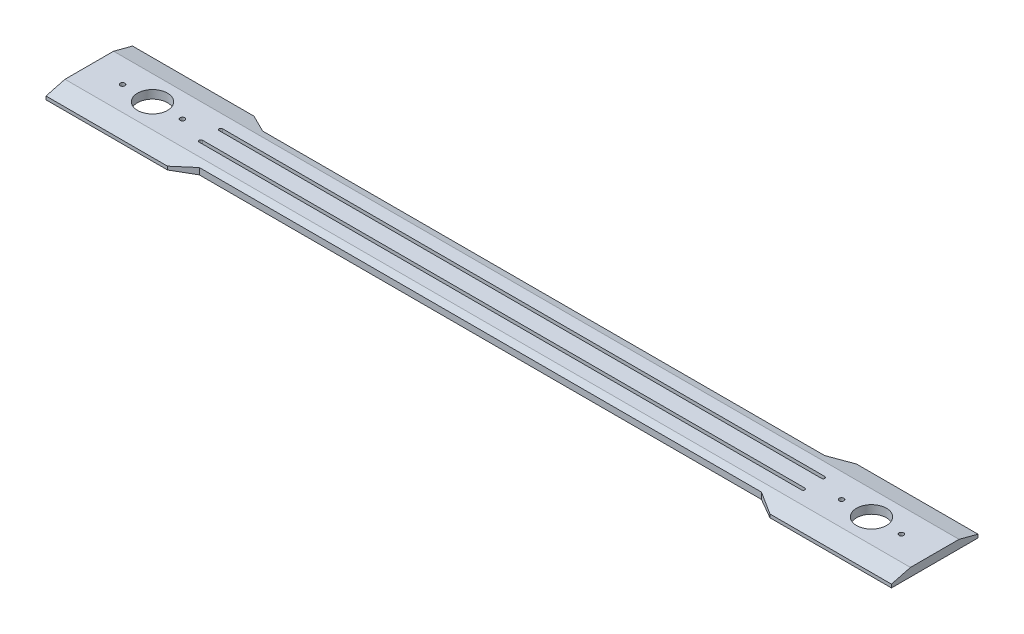
ISO-10303-21;
HEADER;
FILE_DESCRIPTION(('STEP AP214'),'2;1');
FILE_NAME('part.step','',(''),(''),'','','');
FILE_SCHEMA(('AUTOMOTIVE_DESIGN { 1 0 10303 214 1 1 1 1 }'));
ENDSEC;
DATA;
#1=APPLICATION_CONTEXT('core data for automotive mechanical design processes');
#2=APPLICATION_PROTOCOL_DEFINITION('international standard','automotive_design',2000,#1);
#3=PRODUCT_CONTEXT('',#1,'mechanical');
#4=PRODUCT('Part','Part','',(#3));
#5=PRODUCT_RELATED_PRODUCT_CATEGORY('part','',(#4));
#6=PRODUCT_DEFINITION_FORMATION('','',#4);
#7=PRODUCT_DEFINITION_CONTEXT('part definition',#1,'design');
#8=PRODUCT_DEFINITION('design','',#6,#7);
#9=PRODUCT_DEFINITION_SHAPE('','',#8);
#10=(LENGTH_UNIT() NAMED_UNIT(*) SI_UNIT(.MILLI.,.METRE.));
#11=(NAMED_UNIT(*) PLANE_ANGLE_UNIT() SI_UNIT($,.RADIAN.));
#12=(NAMED_UNIT(*) SI_UNIT($,.STERADIAN.) SOLID_ANGLE_UNIT());
#13=UNCERTAINTY_MEASURE_WITH_UNIT(LENGTH_MEASURE(1.E-05),#10,'distance_accuracy_value','');
#14=(GEOMETRIC_REPRESENTATION_CONTEXT(3) GLOBAL_UNCERTAINTY_ASSIGNED_CONTEXT((#13)) GLOBAL_UNIT_ASSIGNED_CONTEXT((#10,
#11,#12)) REPRESENTATION_CONTEXT('',''));
#15=CARTESIAN_POINT('',(0.,0.,0.));
#16=DIRECTION('',(0.,0.,1.));
#17=DIRECTION('',(1.,0.,0.));
#18=AXIS2_PLACEMENT_3D('',#15,#16,#17);
#19=CARTESIAN_POINT('',(0.,25.,0.));
#20=DIRECTION('',(0.,-1.,0.));
#21=DIRECTION('',(0.,0.,-1.));
#22=AXIS2_PLACEMENT_3D('',#19,#20,#21);
#23=PLANE('',#22);
#24=DIRECTION('',(0.,0.,1.));
#25=VECTOR('',#24,1.);
#26=CARTESIAN_POINT('',(-1270.,25.,-130.));
#27=LINE('',#26,#25);
#28=CARTESIAN_POINT('',(-1270.,25.,-73.));
#29=VERTEX_POINT('',#28);
#30=CARTESIAN_POINT('',(-1270.,25.,73.));
#31=VERTEX_POINT('',#30);
#32=EDGE_CURVE('E203',#29,#31,#27,.T.);
#33=ORIENTED_EDGE('',*,*,#32,.T.);
#34=DIRECTION('',(1.,0.,0.));
#35=VECTOR('',#34,1.);
#36=CARTESIAN_POINT('',(-1270.,25.,73.));
#37=LINE('',#36,#35);
#38=CARTESIAN_POINT('',(1270.,25.,73.));
#39=VERTEX_POINT('',#38);
#40=EDGE_CURVE('E58',#31,#39,#37,.T.);
#41=ORIENTED_EDGE('',*,*,#40,.T.);
#42=DIRECTION('',(0.,0.,-1.));
#43=VECTOR('',#42,1.);
#44=CARTESIAN_POINT('',(1270.,25.,-130.));
#45=LINE('',#44,#43);
#46=CARTESIAN_POINT('',(1270.,25.,-73.));
#47=VERTEX_POINT('',#46);
#48=EDGE_CURVE('E207',#39,#47,#45,.T.);
#49=ORIENTED_EDGE('',*,*,#48,.T.);
#50=DIRECTION('',(1.,0.,0.));
#51=VECTOR('',#50,1.);
#52=CARTESIAN_POINT('',(-1270.,25.,-73.));
#53=LINE('',#52,#51);
#54=EDGE_CURVE('E397',#29,#47,#53,.T.);
#55=ORIENTED_EDGE('',*,*,#54,.F.);
#56=EDGE_LOOP('',(#33,#41,#49,#55));
#57=FACE_BOUND('',#56,.T.);
#58=CARTESIAN_POINT('',(-1080.,25.,0.));
#59=DIRECTION('',(0.,1.,0.));
#60=DIRECTION('',(0.,0.,1.));
#61=AXIS2_PLACEMENT_3D('',#58,#59,#60);
#62=CIRCLE('',#61,45.);
#63=CARTESIAN_POINT('',(-1080.,25.,45.));
#64=VERTEX_POINT('',#63);
#65=EDGE_CURVE('E281',#64,#64,#62,.T.);
#66=ORIENTED_EDGE('',*,*,#65,.F.);
#67=EDGE_LOOP('',(#66));
#68=FACE_BOUND('',#67,.T.);
#69=CARTESIAN_POINT('',(-1170.,25.,0.));
#70=DIRECTION('',(0.,1.,0.));
#71=DIRECTION('',(0.,0.,1.));
#72=AXIS2_PLACEMENT_3D('',#69,#70,#71);
#73=CIRCLE('',#72,6.99999999999992);
#74=CARTESIAN_POINT('',(-1170.,25.,6.99999999999992));
#75=VERTEX_POINT('',#74);
#76=EDGE_CURVE('E297',#75,#75,#73,.T.);
#77=ORIENTED_EDGE('',*,*,#76,.F.);
#78=EDGE_LOOP('',(#77));
#79=FACE_BOUND('',#78,.T.);
#80=CARTESIAN_POINT('',(-990.,25.,0.));
#81=DIRECTION('',(0.,1.,0.));
#82=DIRECTION('',(0.,0.,1.));
#83=AXIS2_PLACEMENT_3D('',#80,#81,#82);
#84=CIRCLE('',#83,7.00000000000004);
#85=CARTESIAN_POINT('',(-990.,25.,7.00000000000004));
#86=VERTEX_POINT('',#85);
#87=EDGE_CURVE('E290',#86,#86,#84,.T.);
#88=ORIENTED_EDGE('',*,*,#87,.F.);
#89=EDGE_LOOP('',(#88));
#90=FACE_BOUND('',#89,.T.);
#91=CARTESIAN_POINT('',(1080.,25.,0.));
#92=DIRECTION('',(0.,-1.,0.));
#93=DIRECTION('',(0.,0.,1.));
#94=AXIS2_PLACEMENT_3D('',#91,#92,#93);
#95=CIRCLE('',#94,45.);
#96=CARTESIAN_POINT('',(1080.,25.,45.));
#97=VERTEX_POINT('',#96);
#98=EDGE_CURVE('E302',#97,#97,#95,.T.);
#99=ORIENTED_EDGE('',*,*,#98,.T.);
#100=EDGE_LOOP('',(#99));
#101=FACE_BOUND('',#100,.T.);
#102=CARTESIAN_POINT('',(1170.,25.,0.));
#103=DIRECTION('',(0.,-1.,0.));
#104=DIRECTION('',(0.,0.,1.));
#105=AXIS2_PLACEMENT_3D('',#102,#103,#104);
#106=CIRCLE('',#105,6.99999999999992);
#107=CARTESIAN_POINT('',(1170.,25.,6.99999999999992));
#108=VERTEX_POINT('',#107);
#109=EDGE_CURVE('E315',#108,#108,#106,.T.);
#110=ORIENTED_EDGE('',*,*,#109,.T.);
#111=EDGE_LOOP('',(#110));
#112=FACE_BOUND('',#111,.T.);
#113=CARTESIAN_POINT('',(990.,25.,0.));
#114=DIRECTION('',(0.,-1.,0.));
#115=DIRECTION('',(0.,0.,1.));
#116=AXIS2_PLACEMENT_3D('',#113,#114,#115);
#117=CIRCLE('',#116,7.00000000000004);
#118=CARTESIAN_POINT('',(990.,25.,7.00000000000004));
#119=VERTEX_POINT('',#118);
#120=EDGE_CURVE('E308',#119,#119,#117,.T.);
#121=ORIENTED_EDGE('',*,*,#120,.T.);
#122=EDGE_LOOP('',(#121));
#123=FACE_BOUND('',#122,.T.);
#124=DIRECTION('',(1.,0.,0.));
#125=VECTOR('',#124,1.);
#126=CARTESIAN_POINT('',(-905.,25.,35.));
#127=LINE('',#126,#125);
#128=CARTESIAN_POINT('',(-905.,25.,35.));
#129=VERTEX_POINT('',#128);
#130=CARTESIAN_POINT('',(905.,25.,35.));
#131=VERTEX_POINT('',#130);
#132=EDGE_CURVE('E336',#129,#131,#127,.T.);
#133=ORIENTED_EDGE('',*,*,#132,.F.);
#134=CARTESIAN_POINT('',(-905.,25.,30.));
#135=DIRECTION('',(0.,1.,0.));
#136=DIRECTION('',(0.,0.,-1.));
#137=AXIS2_PLACEMENT_3D('',#134,#135,#136);
#138=CIRCLE('',#137,5.);
#139=CARTESIAN_POINT('',(-905.,25.,25.));
#140=VERTEX_POINT('',#139);
#141=EDGE_CURVE('E339',#140,#129,#138,.T.);
#142=ORIENTED_EDGE('',*,*,#141,.F.);
#143=DIRECTION('',(-1.,0.,0.));
#144=VECTOR('',#143,1.);
#145=CARTESIAN_POINT('',(-905.,25.,25.));
#146=LINE('',#145,#144);
#147=CARTESIAN_POINT('',(905.,25.,25.));
#148=VERTEX_POINT('',#147);
#149=EDGE_CURVE('E329',#148,#140,#146,.T.);
#150=ORIENTED_EDGE('',*,*,#149,.F.);
#151=CARTESIAN_POINT('',(905.,25.,30.));
#152=DIRECTION('',(0.,1.,0.));
#153=DIRECTION('',(0.,0.,1.));
#154=AXIS2_PLACEMENT_3D('',#151,#152,#153);
#155=CIRCLE('',#154,5.);
#156=EDGE_CURVE('E333',#131,#148,#155,.T.);
#157=ORIENTED_EDGE('',*,*,#156,.F.);
#158=EDGE_LOOP('',(#133,#142,#150,#157));
#159=FACE_BOUND('',#158,.T.);
#160=CARTESIAN_POINT('',(-905.,25.,-30.));
#161=DIRECTION('',(0.,-1.,0.));
#162=DIRECTION('',(0.,0.,1.));
#163=AXIS2_PLACEMENT_3D('',#160,#161,#162);
#164=CIRCLE('',#163,5.);
#165=CARTESIAN_POINT('',(-905.,25.,-25.));
#166=VERTEX_POINT('',#165);
#167=CARTESIAN_POINT('',(-905.,25.,-35.));
#168=VERTEX_POINT('',#167);
#169=EDGE_CURVE('E372',#166,#168,#164,.T.);
#170=ORIENTED_EDGE('',*,*,#169,.T.);
#171=DIRECTION('',(1.,0.,0.));
#172=VECTOR('',#171,1.);
#173=CARTESIAN_POINT('',(-905.,25.,-35.));
#174=LINE('',#173,#172);
#175=CARTESIAN_POINT('',(905.,25.,-35.));
#176=VERTEX_POINT('',#175);
#177=EDGE_CURVE('E362',#168,#176,#174,.T.);
#178=ORIENTED_EDGE('',*,*,#177,.T.);
#179=CARTESIAN_POINT('',(905.,25.,-30.));
#180=DIRECTION('',(0.,-1.,0.));
#181=DIRECTION('',(0.,0.,-1.));
#182=AXIS2_PLACEMENT_3D('',#179,#180,#181);
#183=CIRCLE('',#182,5.);
#184=CARTESIAN_POINT('',(905.,25.,-25.));
#185=VERTEX_POINT('',#184);
#186=EDGE_CURVE('E366',#176,#185,#183,.T.);
#187=ORIENTED_EDGE('',*,*,#186,.T.);
#188=DIRECTION('',(-1.,0.,0.));
#189=VECTOR('',#188,1.);
#190=CARTESIAN_POINT('',(-905.,25.,-25.));
#191=LINE('',#190,#189);
#192=EDGE_CURVE('E369',#185,#166,#191,.T.);
#193=ORIENTED_EDGE('',*,*,#192,.T.);
#194=EDGE_LOOP('',(#170,#178,#187,#193));
#195=FACE_BOUND('',#194,.T.);
#196=ADVANCED_FACE('F35',(#57,#68,#79,#90,#101,#112,#123,#159,#195),#23,.F.);
#197=CARTESIAN_POINT('',(0.,0.,0.));
#198=DIRECTION('',(0.,-1.,0.));
#199=DIRECTION('',(0.,0.,-1.));
#200=AXIS2_PLACEMENT_3D('',#197,#198,#199);
#201=PLANE('',#200);
#202=CARTESIAN_POINT('',(-905.,0.,30.));
#203=DIRECTION('',(0.,1.,0.));
#204=DIRECTION('',(0.,0.,-1.));
#205=AXIS2_PLACEMENT_3D('',#202,#203,#204);
#206=CIRCLE('',#205,5.);
#207=CARTESIAN_POINT('',(-905.,0.,25.));
#208=VERTEX_POINT('',#207);
#209=CARTESIAN_POINT('',(-905.,0.,35.));
#210=VERTEX_POINT('',#209);
#211=EDGE_CURVE('E332',#208,#210,#206,.T.);
#212=ORIENTED_EDGE('',*,*,#211,.T.);
#213=DIRECTION('',(1.,0.,0.));
#214=VECTOR('',#213,1.);
#215=CARTESIAN_POINT('',(-905.,0.,35.));
#216=LINE('',#215,#214);
#217=CARTESIAN_POINT('',(905.,0.,35.));
#218=VERTEX_POINT('',#217);
#219=EDGE_CURVE('E347',#210,#218,#216,.T.);
#220=ORIENTED_EDGE('',*,*,#219,.T.);
#221=CARTESIAN_POINT('',(905.,0.,30.));
#222=DIRECTION('',(0.,1.,0.));
#223=DIRECTION('',(0.,0.,1.));
#224=AXIS2_PLACEMENT_3D('',#221,#222,#223);
#225=CIRCLE('',#224,5.);
#226=CARTESIAN_POINT('',(905.,0.,25.));
#227=VERTEX_POINT('',#226);
#228=EDGE_CURVE('E344',#218,#227,#225,.T.);
#229=ORIENTED_EDGE('',*,*,#228,.T.);
#230=DIRECTION('',(-1.,0.,0.));
#231=VECTOR('',#230,1.);
#232=CARTESIAN_POINT('',(-905.,0.,25.));
#233=LINE('',#232,#231);
#234=EDGE_CURVE('E324',#227,#208,#233,.T.);
#235=ORIENTED_EDGE('',*,*,#234,.T.);
#236=EDGE_LOOP('',(#212,#220,#229,#235));
#237=FACE_BOUND('',#236,.T.);
#238=CARTESIAN_POINT('',(990.,0.,0.));
#239=DIRECTION('',(0.,-1.,0.));
#240=DIRECTION('',(0.,0.,1.));
#241=AXIS2_PLACEMENT_3D('',#238,#239,#240);
#242=CIRCLE('',#241,7.00000000000004);
#243=CARTESIAN_POINT('',(990.,0.,7.00000000000004));
#244=VERTEX_POINT('',#243);
#245=EDGE_CURVE('E311',#244,#244,#242,.T.);
#246=ORIENTED_EDGE('',*,*,#245,.F.);
#247=EDGE_LOOP('',(#246));
#248=FACE_BOUND('',#247,.T.);
#249=CARTESIAN_POINT('',(1170.,0.,0.));
#250=DIRECTION('',(0.,-1.,0.));
#251=DIRECTION('',(0.,0.,1.));
#252=AXIS2_PLACEMENT_3D('',#249,#250,#251);
#253=CIRCLE('',#252,6.99999999999992);
#254=CARTESIAN_POINT('',(1170.,0.,6.99999999999992));
#255=VERTEX_POINT('',#254);
#256=EDGE_CURVE('E305',#255,#255,#253,.T.);
#257=ORIENTED_EDGE('',*,*,#256,.F.);
#258=EDGE_LOOP('',(#257));
#259=FACE_BOUND('',#258,.T.);
#260=CARTESIAN_POINT('',(1080.,0.,0.));
#261=DIRECTION('',(0.,-1.,0.));
#262=DIRECTION('',(0.,0.,1.));
#263=AXIS2_PLACEMENT_3D('',#260,#261,#262);
#264=CIRCLE('',#263,45.);
#265=CARTESIAN_POINT('',(1080.,0.,45.));
#266=VERTEX_POINT('',#265);
#267=EDGE_CURVE('E294',#266,#266,#264,.T.);
#268=ORIENTED_EDGE('',*,*,#267,.F.);
#269=EDGE_LOOP('',(#268));
#270=FACE_BOUND('',#269,.T.);
#271=CARTESIAN_POINT('',(-990.,0.,0.));
#272=DIRECTION('',(0.,1.,0.));
#273=DIRECTION('',(0.,0.,1.));
#274=AXIS2_PLACEMENT_3D('',#271,#272,#273);
#275=CIRCLE('',#274,7.00000000000004);
#276=CARTESIAN_POINT('',(-990.,0.,7.00000000000004));
#277=VERTEX_POINT('',#276);
#278=EDGE_CURVE('E293',#277,#277,#275,.T.);
#279=ORIENTED_EDGE('',*,*,#278,.T.);
#280=EDGE_LOOP('',(#279));
#281=FACE_BOUND('',#280,.T.);
#282=CARTESIAN_POINT('',(-1170.,0.,0.));
#283=DIRECTION('',(0.,1.,0.));
#284=DIRECTION('',(0.,0.,1.));
#285=AXIS2_PLACEMENT_3D('',#282,#283,#284);
#286=CIRCLE('',#285,6.99999999999992);
#287=CARTESIAN_POINT('',(-1170.,0.,6.99999999999992));
#288=VERTEX_POINT('',#287);
#289=EDGE_CURVE('E288',#288,#288,#286,.T.);
#290=ORIENTED_EDGE('',*,*,#289,.T.);
#291=EDGE_LOOP('',(#290));
#292=FACE_BOUND('',#291,.T.);
#293=CARTESIAN_POINT('',(-1080.,0.,0.));
#294=DIRECTION('',(0.,1.,0.));
#295=DIRECTION('',(0.,0.,1.));
#296=AXIS2_PLACEMENT_3D('',#293,#294,#295);
#297=CIRCLE('',#296,45.);
#298=CARTESIAN_POINT('',(-1080.,0.,45.));
#299=VERTEX_POINT('',#298);
#300=EDGE_CURVE('E283',#299,#299,#297,.T.);
#301=ORIENTED_EDGE('',*,*,#300,.T.);
#302=EDGE_LOOP('',(#301));
#303=FACE_BOUND('',#302,.T.);
#304=DIRECTION('',(1.,0.,0.));
#305=VECTOR('',#304,1.);
#306=CARTESIAN_POINT('',(-1270.,0.,130.));
#307=LINE('',#306,#305);
#308=CARTESIAN_POINT('',(-1270.,0.,130.));
#309=VERTEX_POINT('',#308);
#310=CARTESIAN_POINT('',(-905.,0.,130.));
#311=VERTEX_POINT('',#310);
#312=EDGE_CURVE('E242',#309,#311,#307,.T.);
#313=ORIENTED_EDGE('',*,*,#312,.F.);
#314=DIRECTION('',(0.,0.,1.));
#315=VECTOR('',#314,1.);
#316=CARTESIAN_POINT('',(-1270.,0.,-130.));
#317=LINE('',#316,#315);
#318=CARTESIAN_POINT('',(-1270.,0.,-130.));
#319=VERTEX_POINT('',#318);
#320=EDGE_CURVE('E200',#319,#309,#317,.T.);
#321=ORIENTED_EDGE('',*,*,#320,.F.);
#322=DIRECTION('',(-1.,0.,0.));
#323=VECTOR('',#322,1.);
#324=CARTESIAN_POINT('',(-1270.,0.,-130.));
#325=LINE('',#324,#323);
#326=CARTESIAN_POINT('',(-905.,0.,-130.));
#327=VERTEX_POINT('',#326);
#328=EDGE_CURVE('E270',#327,#319,#325,.T.);
#329=ORIENTED_EDGE('',*,*,#328,.F.);
#330=DIRECTION('',(-0.866025403784439,0.,-0.499999999999999));
#331=VECTOR('',#330,1.);
#332=CARTESIAN_POINT('',(-905.,0.,-130.));
#333=LINE('',#332,#331);
#334=CARTESIAN_POINT('',(-844.378221735089,0.,-95.));
#335=VERTEX_POINT('',#334);
#336=EDGE_CURVE('E268',#335,#327,#333,.T.);
#337=ORIENTED_EDGE('',*,*,#336,.F.);
#338=DIRECTION('',(-1.,0.,0.));
#339=VECTOR('',#338,1.);
#340=CARTESIAN_POINT('',(-844.378221735089,0.,-95.));
#341=LINE('',#340,#339);
#342=CARTESIAN_POINT('',(844.378221735089,0.,-95.));
#343=VERTEX_POINT('',#342);
#344=EDGE_CURVE('E265',#343,#335,#341,.T.);
#345=ORIENTED_EDGE('',*,*,#344,.F.);
#346=DIRECTION('',(-0.866025403784439,0.,0.499999999999999));
#347=VECTOR('',#346,1.);
#348=CARTESIAN_POINT('',(905.,0.,-130.));
#349=LINE('',#348,#347);
#350=CARTESIAN_POINT('',(905.,0.,-130.));
#351=VERTEX_POINT('',#350);
#352=EDGE_CURVE('E262',#351,#343,#349,.T.);
#353=ORIENTED_EDGE('',*,*,#352,.F.);
#354=DIRECTION('',(-1.,0.,0.));
#355=VECTOR('',#354,1.);
#356=CARTESIAN_POINT('',(1270.,0.,-130.));
#357=LINE('',#356,#355);
#358=CARTESIAN_POINT('',(1270.,0.,-130.));
#359=VERTEX_POINT('',#358);
#360=EDGE_CURVE('E259',#359,#351,#357,.T.);
#361=ORIENTED_EDGE('',*,*,#360,.F.);
#362=DIRECTION('',(0.,0.,-1.));
#363=VECTOR('',#362,1.);
#364=CARTESIAN_POINT('',(1270.,0.,-130.));
#365=LINE('',#364,#363);
#366=CARTESIAN_POINT('',(1270.,0.,130.));
#367=VERTEX_POINT('',#366);
#368=EDGE_CURVE('E256',#367,#359,#365,.T.);
#369=ORIENTED_EDGE('',*,*,#368,.F.);
#370=DIRECTION('',(1.,0.,0.));
#371=VECTOR('',#370,1.);
#372=CARTESIAN_POINT('',(1270.,0.,130.));
#373=LINE('',#372,#371);
#374=CARTESIAN_POINT('',(905.,0.,130.));
#375=VERTEX_POINT('',#374);
#376=EDGE_CURVE('E250',#375,#367,#373,.T.);
#377=ORIENTED_EDGE('',*,*,#376,.F.);
#378=DIRECTION('',(0.866025403784439,0.,0.499999999999999));
#379=VECTOR('',#378,1.);
#380=CARTESIAN_POINT('',(905.,0.,130.));
#381=LINE('',#380,#379);
#382=CARTESIAN_POINT('',(844.378221735089,0.,95.));
#383=VERTEX_POINT('',#382);
#384=EDGE_CURVE('E248',#383,#375,#381,.T.);
#385=ORIENTED_EDGE('',*,*,#384,.F.);
#386=DIRECTION('',(1.,0.,0.));
#387=VECTOR('',#386,1.);
#388=CARTESIAN_POINT('',(-844.378221735089,0.,95.));
#389=LINE('',#388,#387);
#390=CARTESIAN_POINT('',(-844.378221735089,0.,95.));
#391=VERTEX_POINT('',#390);
#392=EDGE_CURVE('E234',#391,#383,#389,.T.);
#393=ORIENTED_EDGE('',*,*,#392,.F.);
#394=DIRECTION('',(0.866025403784438,0.,-0.500000000000001));
#395=VECTOR('',#394,1.);
#396=CARTESIAN_POINT('',(-905.,0.,130.));
#397=LINE('',#396,#395);
#398=EDGE_CURVE('E239',#311,#391,#397,.T.);
#399=ORIENTED_EDGE('',*,*,#398,.F.);
#400=EDGE_LOOP('',(#313,#321,#329,#337,#345,#353,#361,#369,#377,#385,#393,#399));
#401=FACE_BOUND('',#400,.T.);
#402=DIRECTION('',(1.,0.,0.));
#403=VECTOR('',#402,1.);
#404=CARTESIAN_POINT('',(-905.,0.,-35.));
#405=LINE('',#404,#403);
#406=CARTESIAN_POINT('',(-905.,0.,-35.));
#407=VERTEX_POINT('',#406);
#408=CARTESIAN_POINT('',(905.,0.,-35.));
#409=VERTEX_POINT('',#408);
#410=EDGE_CURVE('E356',#407,#409,#405,.T.);
#411=ORIENTED_EDGE('',*,*,#410,.F.);
#412=CARTESIAN_POINT('',(-905.,0.,-30.));
#413=DIRECTION('',(0.,-1.,0.));
#414=DIRECTION('',(0.,0.,1.));
#415=AXIS2_PLACEMENT_3D('',#412,#413,#414);
#416=CIRCLE('',#415,5.);
#417=CARTESIAN_POINT('',(-905.,0.,-25.));
#418=VERTEX_POINT('',#417);
#419=EDGE_CURVE('E365',#418,#407,#416,.T.);
#420=ORIENTED_EDGE('',*,*,#419,.F.);
#421=DIRECTION('',(-1.,0.,0.));
#422=VECTOR('',#421,1.);
#423=CARTESIAN_POINT('',(-905.,0.,-25.));
#424=LINE('',#423,#422);
#425=CARTESIAN_POINT('',(905.,0.,-25.));
#426=VERTEX_POINT('',#425);
#427=EDGE_CURVE('E380',#426,#418,#424,.T.);
#428=ORIENTED_EDGE('',*,*,#427,.F.);
#429=CARTESIAN_POINT('',(905.,0.,-30.));
#430=DIRECTION('',(0.,-1.,0.));
#431=DIRECTION('',(0.,0.,-1.));
#432=AXIS2_PLACEMENT_3D('',#429,#430,#431);
#433=CIRCLE('',#432,5.);
#434=EDGE_CURVE('E377',#409,#426,#433,.T.);
#435=ORIENTED_EDGE('',*,*,#434,.F.);
#436=EDGE_LOOP('',(#411,#420,#428,#435));
#437=FACE_BOUND('',#436,.T.);
#438=ADVANCED_FACE('F244',(#237,#248,#259,#270,#281,#292,#303,#401,#437),#201,.T.);
#439=CARTESIAN_POINT('',(-1270.,25.,130.));
#440=DIRECTION('',(0.,0.,-1.));
#441=DIRECTION('',(-1.,0.,0.));
#442=AXIS2_PLACEMENT_3D('',#439,#440,#441);
#443=PLANE('',#442);
#444=DIRECTION('',(0.,-1.,0.));
#445=VECTOR('',#444,1.);
#446=CARTESIAN_POINT('',(-905.,25.,130.));
#447=LINE('',#446,#445);
#448=CARTESIAN_POINT('',(-905.,10.,130.));
#449=VERTEX_POINT('',#448);
#450=EDGE_CURVE('E11',#449,#311,#447,.T.);
#451=ORIENTED_EDGE('',*,*,#450,.F.);
#452=DIRECTION('',(1.,0.,0.));
#453=VECTOR('',#452,1.);
#454=CARTESIAN_POINT('',(-1270.,10.,130.));
#455=LINE('',#454,#453);
#456=CARTESIAN_POINT('',(-1270.,10.,130.));
#457=VERTEX_POINT('',#456);
#458=EDGE_CURVE('E183',#457,#449,#455,.T.);
#459=ORIENTED_EDGE('',*,*,#458,.F.);
#460=DIRECTION('',(0.,-1.,0.));
#461=VECTOR('',#460,1.);
#462=CARTESIAN_POINT('',(-1270.,25.,130.));
#463=LINE('',#462,#461);
#464=EDGE_CURVE('E195',#457,#309,#463,.T.);
#465=ORIENTED_EDGE('',*,*,#464,.T.);
#466=ORIENTED_EDGE('',*,*,#312,.T.);
#467=EDGE_LOOP('',(#451,#459,#465,#466));
#468=FACE_BOUND('',#467,.T.);
#469=ADVANCED_FACE('F37',(#468),#443,.F.);
#470=CARTESIAN_POINT('',(-905.,25.,130.));
#471=DIRECTION('',(-0.500000000000001,0.,-0.866025403784438));
#472=DIRECTION('',(-0.866025403784438,0.,0.500000000000001));
#473=AXIS2_PLACEMENT_3D('',#470,#471,#472);
#474=PLANE('',#473);
#475=DIRECTION('',(0.,-1.,0.));
#476=VECTOR('',#475,1.);
#477=CARTESIAN_POINT('',(-844.378221735089,25.,95.));
#478=LINE('',#477,#476);
#479=CARTESIAN_POINT('',(-844.378221735089,19.2105263157895,95.));
#480=VERTEX_POINT('',#479);
#481=EDGE_CURVE('E43',#480,#391,#478,.T.);
#482=ORIENTED_EDGE('',*,*,#481,.F.);
#483=DIRECTION('',(-0.858624606631047,-0.130454512571388,0.495727147771273));
#484=VECTOR('',#483,1.);
#485=CARTESIAN_POINT('',(-903.319828181902,10.2552756977536,129.029952348536));
#486=LINE('',#485,#484);
#487=EDGE_CURVE('E375',#480,#449,#486,.T.);
#488=ORIENTED_EDGE('',*,*,#487,.T.);
#489=ORIENTED_EDGE('',*,*,#450,.T.);
#490=ORIENTED_EDGE('',*,*,#398,.T.);
#491=EDGE_LOOP('',(#482,#488,#489,#490));
#492=FACE_BOUND('',#491,.T.);
#493=ADVANCED_FACE('F240',(#492),#474,.F.);
#494=CARTESIAN_POINT('',(-844.378221735089,25.,95.));
#495=DIRECTION('',(0.,0.,-1.));
#496=DIRECTION('',(-1.,0.,0.));
#497=AXIS2_PLACEMENT_3D('',#494,#495,#496);
#498=PLANE('',#497);
#499=DIRECTION('',(0.,-1.,0.));
#500=VECTOR('',#499,1.);
#501=CARTESIAN_POINT('',(844.378221735089,25.,95.));
#502=LINE('',#501,#500);
#503=CARTESIAN_POINT('',(844.378221735089,19.2105263157895,95.));
#504=VERTEX_POINT('',#503);
#505=EDGE_CURVE('E225',#504,#383,#502,.T.);
#506=ORIENTED_EDGE('',*,*,#505,.F.);
#507=DIRECTION('',(-1.,0.,0.));
#508=VECTOR('',#507,1.);
#509=CARTESIAN_POINT('',(-844.378221735089,19.2105263157895,95.));
#510=LINE('',#509,#508);
#511=EDGE_CURVE('E236',#504,#480,#510,.T.);
#512=ORIENTED_EDGE('',*,*,#511,.T.);
#513=ORIENTED_EDGE('',*,*,#481,.T.);
#514=ORIENTED_EDGE('',*,*,#392,.T.);
#515=EDGE_LOOP('',(#506,#512,#513,#514));
#516=FACE_BOUND('',#515,.T.);
#517=ADVANCED_FACE('F232',(#516),#498,.F.);
#518=CARTESIAN_POINT('',(905.,25.,130.));
#519=DIRECTION('',(0.499999999999999,0.,-0.866025403784439));
#520=DIRECTION('',(-0.866025403784439,0.,-0.499999999999999));
#521=AXIS2_PLACEMENT_3D('',#518,#519,#520);
#522=PLANE('',#521);
#523=DIRECTION('',(0.,-1.,0.));
#524=VECTOR('',#523,1.);
#525=CARTESIAN_POINT('',(905.,25.,130.));
#526=LINE('',#525,#524);
#527=CARTESIAN_POINT('',(904.999999999999,10.,130.));
#528=VERTEX_POINT('',#527);
#529=EDGE_CURVE('E223',#528,#375,#526,.T.);
#530=ORIENTED_EDGE('',*,*,#529,.F.);
#531=DIRECTION('',(-0.858624606631048,0.130454512571387,-0.495727147771271));
#532=VECTOR('',#531,1.);
#533=CARTESIAN_POINT('',(903.319828181902,10.2552756977536,129.029952348536));
#534=LINE('',#533,#532);
#535=EDGE_CURVE('E385',#528,#504,#534,.T.);
#536=ORIENTED_EDGE('',*,*,#535,.T.);
#537=ORIENTED_EDGE('',*,*,#505,.T.);
#538=ORIENTED_EDGE('',*,*,#384,.T.);
#539=EDGE_LOOP('',(#530,#536,#537,#538));
#540=FACE_BOUND('',#539,.T.);
#541=ADVANCED_FACE('F627',(#540),#522,.F.);
#542=CARTESIAN_POINT('',(1270.,25.,130.));
#543=DIRECTION('',(0.,0.,-1.));
#544=DIRECTION('',(-1.,0.,0.));
#545=AXIS2_PLACEMENT_3D('',#542,#543,#544);
#546=PLANE('',#545);
#547=DIRECTION('',(0.,-1.,0.));
#548=VECTOR('',#547,1.);
#549=CARTESIAN_POINT('',(1270.,25.,130.));
#550=LINE('',#549,#548);
#551=CARTESIAN_POINT('',(1270.,10.,130.));
#552=VERTEX_POINT('',#551);
#553=EDGE_CURVE('E221',#552,#367,#550,.T.);
#554=ORIENTED_EDGE('',*,*,#553,.F.);
#555=EDGE_CURVE('E189',#528,#552,#455,.T.);
#556=ORIENTED_EDGE('',*,*,#555,.F.);
#557=ORIENTED_EDGE('',*,*,#529,.T.);
#558=ORIENTED_EDGE('',*,*,#376,.T.);
#559=EDGE_LOOP('',(#554,#556,#557,#558));
#560=FACE_BOUND('',#559,.T.);
#561=ADVANCED_FACE('F618',(#560),#546,.F.);
#562=CARTESIAN_POINT('',(1270.,25.,-130.));
#563=DIRECTION('',(-1.,0.,0.));
#564=DIRECTION('',(0.,0.,1.));
#565=AXIS2_PLACEMENT_3D('',#562,#563,#564);
#566=PLANE('',#565);
#567=ORIENTED_EDGE('',*,*,#48,.F.);
#568=DIRECTION('',(0.,0.254493299279644,-0.967074537262646));
#569=VECTOR('',#568,1.);
#570=CARTESIAN_POINT('',(1270.,25.,73.));
#571=LINE('',#570,#569);
#572=EDGE_CURVE('E190',#552,#39,#571,.T.);
#573=ORIENTED_EDGE('',*,*,#572,.F.);
#574=ORIENTED_EDGE('',*,*,#553,.T.);
#575=ORIENTED_EDGE('',*,*,#368,.T.);
#576=DIRECTION('',(0.,-1.,0.));
#577=VECTOR('',#576,1.);
#578=CARTESIAN_POINT('',(1270.,25.,-130.));
#579=LINE('',#578,#577);
#580=CARTESIAN_POINT('',(1270.,10.,-130.));
#581=VERTEX_POINT('',#580);
#582=EDGE_CURVE('E219',#581,#359,#579,.T.);
#583=ORIENTED_EDGE('',*,*,#582,.F.);
#584=DIRECTION('',(0.,-0.254493299279644,-0.967074537262646));
#585=VECTOR('',#584,1.);
#586=CARTESIAN_POINT('',(1270.,25.,-73.));
#587=LINE('',#586,#585);
#588=EDGE_CURVE('E402',#47,#581,#587,.T.);
#589=ORIENTED_EDGE('',*,*,#588,.F.);
#590=EDGE_LOOP('',(#567,#573,#574,#575,#583,#589));
#591=FACE_BOUND('',#590,.T.);
#592=ADVANCED_FACE('F412',(#591),#566,.F.);
#593=CARTESIAN_POINT('',(1270.,25.,-130.));
#594=DIRECTION('',(0.,0.,1.));
#595=DIRECTION('',(1.,0.,0.));
#596=AXIS2_PLACEMENT_3D('',#593,#594,#595);
#597=PLANE('',#596);
#598=DIRECTION('',(0.,-1.,0.));
#599=VECTOR('',#598,1.);
#600=CARTESIAN_POINT('',(905.,25.,-130.));
#601=LINE('',#600,#599);
#602=CARTESIAN_POINT('',(904.999999999999,10.0000000000001,-130.));
#603=VERTEX_POINT('',#602);
#604=EDGE_CURVE('E217',#603,#351,#601,.T.);
#605=ORIENTED_EDGE('',*,*,#604,.F.);
#606=DIRECTION('',(1.,0.,0.));
#607=VECTOR('',#606,1.);
#608=CARTESIAN_POINT('',(-1270.,10.,-130.));
#609=LINE('',#608,#607);
#610=EDGE_CURVE('E399',#603,#581,#609,.T.);
#611=ORIENTED_EDGE('',*,*,#610,.T.);
#612=ORIENTED_EDGE('',*,*,#582,.T.);
#613=ORIENTED_EDGE('',*,*,#360,.T.);
#614=EDGE_LOOP('',(#605,#611,#612,#613));
#615=FACE_BOUND('',#614,.T.);
#616=ADVANCED_FACE('F418',(#615),#597,.F.);
#617=CARTESIAN_POINT('',(905.,25.,-130.));
#618=DIRECTION('',(0.499999999999999,0.,0.866025403784439));
#619=DIRECTION('',(0.866025403784439,0.,-0.499999999999999));
#620=AXIS2_PLACEMENT_3D('',#617,#618,#619);
#621=PLANE('',#620);
#622=DIRECTION('',(0.,-1.,0.));
#623=VECTOR('',#622,1.);
#624=CARTESIAN_POINT('',(844.378221735089,25.,-95.));
#625=LINE('',#624,#623);
#626=CARTESIAN_POINT('',(844.378221735089,19.2105263157895,-95.));
#627=VERTEX_POINT('',#626);
#628=EDGE_CURVE('E215',#627,#343,#625,.T.);
#629=ORIENTED_EDGE('',*,*,#628,.F.);
#630=DIRECTION('',(0.858624606631048,-0.130454512571387,-0.495727147771271));
#631=VECTOR('',#630,1.);
#632=CARTESIAN_POINT('',(903.319828181902,10.2552756977536,-129.029952348536));
#633=LINE('',#632,#631);
#634=EDGE_CURVE('E388',#627,#603,#633,.T.);
#635=ORIENTED_EDGE('',*,*,#634,.T.);
#636=ORIENTED_EDGE('',*,*,#604,.T.);
#637=ORIENTED_EDGE('',*,*,#352,.T.);
#638=EDGE_LOOP('',(#629,#635,#636,#637));
#639=FACE_BOUND('',#638,.T.);
#640=ADVANCED_FACE('F423',(#639),#621,.F.);
#641=CARTESIAN_POINT('',(-844.378221735089,25.,-95.));
#642=DIRECTION('',(0.,0.,1.));
#643=DIRECTION('',(1.,0.,0.));
#644=AXIS2_PLACEMENT_3D('',#641,#642,#643);
#645=PLANE('',#644);
#646=DIRECTION('',(0.,-1.,0.));
#647=VECTOR('',#646,1.);
#648=CARTESIAN_POINT('',(-844.378221735089,25.,-95.));
#649=LINE('',#648,#647);
#650=CARTESIAN_POINT('',(-844.378221735089,19.2105263157895,-95.));
#651=VERTEX_POINT('',#650);
#652=EDGE_CURVE('E213',#651,#335,#649,.T.);
#653=ORIENTED_EDGE('',*,*,#652,.F.);
#654=DIRECTION('',(1.,0.,0.));
#655=VECTOR('',#654,1.);
#656=CARTESIAN_POINT('',(-844.378221735089,19.2105263157895,-95.));
#657=LINE('',#656,#655);
#658=EDGE_CURVE('E391',#651,#627,#657,.T.);
#659=ORIENTED_EDGE('',*,*,#658,.T.);
#660=ORIENTED_EDGE('',*,*,#628,.T.);
#661=ORIENTED_EDGE('',*,*,#344,.T.);
#662=EDGE_LOOP('',(#653,#659,#660,#661));
#663=FACE_BOUND('',#662,.T.);
#664=ADVANCED_FACE('F427',(#663),#645,.F.);
#665=CARTESIAN_POINT('',(-905.,25.,-130.));
#666=DIRECTION('',(-0.499999999999999,0.,0.866025403784439));
#667=DIRECTION('',(0.866025403784439,0.,0.499999999999999));
#668=AXIS2_PLACEMENT_3D('',#665,#666,#667);
#669=PLANE('',#668);
#670=DIRECTION('',(0.,-1.,0.));
#671=VECTOR('',#670,1.);
#672=CARTESIAN_POINT('',(-905.,25.,-130.));
#673=LINE('',#672,#671);
#674=CARTESIAN_POINT('',(-905.,10.,-130.));
#675=VERTEX_POINT('',#674);
#676=EDGE_CURVE('E205',#675,#327,#673,.T.);
#677=ORIENTED_EDGE('',*,*,#676,.F.);
#678=DIRECTION('',(0.858624606631048,0.130454512571387,0.495727147771271));
#679=VECTOR('',#678,1.);
#680=CARTESIAN_POINT('',(-903.319828181902,10.2552756977536,-129.029952348536));
#681=LINE('',#680,#679);
#682=EDGE_CURVE('E394',#675,#651,#681,.T.);
#683=ORIENTED_EDGE('',*,*,#682,.T.);
#684=ORIENTED_EDGE('',*,*,#652,.T.);
#685=ORIENTED_EDGE('',*,*,#336,.T.);
#686=EDGE_LOOP('',(#677,#683,#684,#685));
#687=FACE_BOUND('',#686,.T.);
#688=ADVANCED_FACE('F431',(#687),#669,.F.);
#689=CARTESIAN_POINT('',(-1270.,25.,-130.));
#690=DIRECTION('',(0.,0.,1.));
#691=DIRECTION('',(1.,0.,0.));
#692=AXIS2_PLACEMENT_3D('',#689,#690,#691);
#693=PLANE('',#692);
#694=DIRECTION('',(0.,-1.,0.));
#695=VECTOR('',#694,1.);
#696=CARTESIAN_POINT('',(-1270.,25.,-130.));
#697=LINE('',#696,#695);
#698=CARTESIAN_POINT('',(-1270.,10.,-130.));
#699=VERTEX_POINT('',#698);
#700=EDGE_CURVE('E202',#699,#319,#697,.T.);
#701=ORIENTED_EDGE('',*,*,#700,.F.);
#702=EDGE_CURVE('E50',#699,#675,#609,.T.);
#703=ORIENTED_EDGE('',*,*,#702,.T.);
#704=ORIENTED_EDGE('',*,*,#676,.T.);
#705=ORIENTED_EDGE('',*,*,#328,.T.);
#706=EDGE_LOOP('',(#701,#703,#704,#705));
#707=FACE_BOUND('',#706,.T.);
#708=ADVANCED_FACE('F432',(#707),#693,.F.);
#709=CARTESIAN_POINT('',(-1270.,25.,-130.));
#710=DIRECTION('',(1.,0.,0.));
#711=DIRECTION('',(0.,0.,-1.));
#712=AXIS2_PLACEMENT_3D('',#709,#710,#711);
#713=PLANE('',#712);
#714=ORIENTED_EDGE('',*,*,#464,.F.);
#715=DIRECTION('',(0.,0.254493299279644,-0.967074537262646));
#716=VECTOR('',#715,1.);
#717=CARTESIAN_POINT('',(-1270.,25.,73.));
#718=LINE('',#717,#716);
#719=EDGE_CURVE('E180',#457,#31,#718,.T.);
#720=ORIENTED_EDGE('',*,*,#719,.T.);
#721=ORIENTED_EDGE('',*,*,#32,.F.);
#722=DIRECTION('',(0.,-0.254493299279644,-0.967074537262646));
#723=VECTOR('',#722,1.);
#724=CARTESIAN_POINT('',(-1270.,25.,-73.));
#725=LINE('',#724,#723);
#726=EDGE_CURVE('E400',#29,#699,#725,.T.);
#727=ORIENTED_EDGE('',*,*,#726,.T.);
#728=ORIENTED_EDGE('',*,*,#700,.T.);
#729=ORIENTED_EDGE('',*,*,#320,.T.);
#730=EDGE_LOOP('',(#714,#720,#721,#727,#728,#729));
#731=FACE_BOUND('',#730,.T.);
#732=ADVANCED_FACE('F198',(#731),#713,.F.);
#733=CARTESIAN_POINT('',(-1080.,0.,0.));
#734=DIRECTION('',(0.,1.,0.));
#735=DIRECTION('',(0.,0.,1.));
#736=AXIS2_PLACEMENT_3D('',#733,#734,#735);
#737=CYLINDRICAL_SURFACE('',#736,45.);
#738=ORIENTED_EDGE('',*,*,#300,.F.);
#739=EDGE_LOOP('',(#738));
#740=FACE_BOUND('',#739,.T.);
#741=ORIENTED_EDGE('',*,*,#65,.T.);
#742=EDGE_LOOP('',(#741));
#743=FACE_BOUND('',#742,.T.);
#744=ADVANCED_FACE('F439',(#740,#743),#737,.F.);
#745=CARTESIAN_POINT('',(-1170.,0.,0.));
#746=DIRECTION('',(0.,1.,0.));
#747=DIRECTION('',(0.,0.,1.));
#748=AXIS2_PLACEMENT_3D('',#745,#746,#747);
#749=CYLINDRICAL_SURFACE('',#748,6.99999999999992);
#750=ORIENTED_EDGE('',*,*,#289,.F.);
#751=EDGE_LOOP('',(#750));
#752=FACE_BOUND('',#751,.T.);
#753=ORIENTED_EDGE('',*,*,#76,.T.);
#754=EDGE_LOOP('',(#753));
#755=FACE_BOUND('',#754,.T.);
#756=ADVANCED_FACE('F452',(#752,#755),#749,.F.);
#757=CARTESIAN_POINT('',(-990.,0.,0.));
#758=DIRECTION('',(0.,1.,0.));
#759=DIRECTION('',(0.,0.,1.));
#760=AXIS2_PLACEMENT_3D('',#757,#758,#759);
#761=CYLINDRICAL_SURFACE('',#760,7.00000000000004);
#762=ORIENTED_EDGE('',*,*,#278,.F.);
#763=EDGE_LOOP('',(#762));
#764=FACE_BOUND('',#763,.T.);
#765=ORIENTED_EDGE('',*,*,#87,.T.);
#766=EDGE_LOOP('',(#765));
#767=FACE_BOUND('',#766,.T.);
#768=ADVANCED_FACE('F454',(#764,#767),#761,.F.);
#769=CARTESIAN_POINT('',(1080.,0.,0.));
#770=DIRECTION('',(0.,1.,0.));
#771=DIRECTION('',(0.,0.,1.));
#772=AXIS2_PLACEMENT_3D('',#769,#770,#771);
#773=CYLINDRICAL_SURFACE('',#772,45.);
#774=ORIENTED_EDGE('',*,*,#267,.T.);
#775=EDGE_LOOP('',(#774));
#776=FACE_BOUND('',#775,.T.);
#777=ORIENTED_EDGE('',*,*,#98,.F.);
#778=EDGE_LOOP('',(#777));
#779=FACE_BOUND('',#778,.T.);
#780=ADVANCED_FACE('F457',(#776,#779),#773,.F.);
#781=CARTESIAN_POINT('',(1170.,0.,0.));
#782=DIRECTION('',(0.,1.,0.));
#783=DIRECTION('',(0.,0.,1.));
#784=AXIS2_PLACEMENT_3D('',#781,#782,#783);
#785=CYLINDRICAL_SURFACE('',#784,6.99999999999992);
#786=ORIENTED_EDGE('',*,*,#256,.T.);
#787=EDGE_LOOP('',(#786));
#788=FACE_BOUND('',#787,.T.);
#789=ORIENTED_EDGE('',*,*,#109,.F.);
#790=EDGE_LOOP('',(#789));
#791=FACE_BOUND('',#790,.T.);
#792=ADVANCED_FACE('F464',(#788,#791),#785,.F.);
#793=CARTESIAN_POINT('',(990.,0.,0.));
#794=DIRECTION('',(0.,1.,0.));
#795=DIRECTION('',(0.,0.,1.));
#796=AXIS2_PLACEMENT_3D('',#793,#794,#795);
#797=CYLINDRICAL_SURFACE('',#796,7.00000000000004);
#798=ORIENTED_EDGE('',*,*,#245,.T.);
#799=EDGE_LOOP('',(#798));
#800=FACE_BOUND('',#799,.T.);
#801=ORIENTED_EDGE('',*,*,#120,.F.);
#802=EDGE_LOOP('',(#801));
#803=FACE_BOUND('',#802,.T.);
#804=ADVANCED_FACE('F466',(#800,#803),#797,.F.);
#805=CARTESIAN_POINT('',(-905.,0.,30.));
#806=DIRECTION('',(0.,1.,0.));
#807=DIRECTION('',(0.,0.,1.));
#808=AXIS2_PLACEMENT_3D('',#805,#806,#807);
#809=CYLINDRICAL_SURFACE('',#808,5.);
#810=ORIENTED_EDGE('',*,*,#141,.T.);
#811=DIRECTION('',(0.,1.,0.));
#812=VECTOR('',#811,1.);
#813=CARTESIAN_POINT('',(-905.,0.,35.));
#814=LINE('',#813,#812);
#815=EDGE_CURVE('E320',#210,#129,#814,.T.);
#816=ORIENTED_EDGE('',*,*,#815,.F.);
#817=ORIENTED_EDGE('',*,*,#211,.F.);
#818=DIRECTION('',(0.,1.,0.));
#819=VECTOR('',#818,1.);
#820=CARTESIAN_POINT('',(-905.,0.,25.));
#821=LINE('',#820,#819);
#822=EDGE_CURVE('E312',#208,#140,#821,.T.);
#823=ORIENTED_EDGE('',*,*,#822,.T.);
#824=EDGE_LOOP('',(#810,#816,#817,#823));
#825=FACE_BOUND('',#824,.T.);
#826=ADVANCED_FACE('F469',(#825),#809,.F.);
#827=CARTESIAN_POINT('',(-905.,0.,25.));
#828=DIRECTION('',(0.,0.,-1.));
#829=DIRECTION('',(-1.,0.,0.));
#830=AXIS2_PLACEMENT_3D('',#827,#828,#829);
#831=PLANE('',#830);
#832=ORIENTED_EDGE('',*,*,#149,.T.);
#833=ORIENTED_EDGE('',*,*,#822,.F.);
#834=ORIENTED_EDGE('',*,*,#234,.F.);
#835=DIRECTION('',(0.,1.,0.));
#836=VECTOR('',#835,1.);
#837=CARTESIAN_POINT('',(905.,0.,25.));
#838=LINE('',#837,#836);
#839=EDGE_CURVE('E326',#227,#148,#838,.T.);
#840=ORIENTED_EDGE('',*,*,#839,.T.);
#841=EDGE_LOOP('',(#832,#833,#834,#840));
#842=FACE_BOUND('',#841,.T.);
#843=ADVANCED_FACE('F476',(#842),#831,.F.);
#844=CARTESIAN_POINT('',(905.,0.,30.));
#845=DIRECTION('',(0.,1.,0.));
#846=DIRECTION('',(0.,0.,1.));
#847=AXIS2_PLACEMENT_3D('',#844,#845,#846);
#848=CYLINDRICAL_SURFACE('',#847,5.);
#849=ORIENTED_EDGE('',*,*,#156,.T.);
#850=ORIENTED_EDGE('',*,*,#839,.F.);
#851=ORIENTED_EDGE('',*,*,#228,.F.);
#852=DIRECTION('',(0.,1.,0.));
#853=VECTOR('',#852,1.);
#854=CARTESIAN_POINT('',(905.,0.,35.));
#855=LINE('',#854,#853);
#856=EDGE_CURVE('E323',#218,#131,#855,.T.);
#857=ORIENTED_EDGE('',*,*,#856,.T.);
#858=EDGE_LOOP('',(#849,#850,#851,#857));
#859=FACE_BOUND('',#858,.T.);
#860=ADVANCED_FACE('F482',(#859),#848,.F.);
#861=CARTESIAN_POINT('',(-905.,0.,35.));
#862=DIRECTION('',(0.,0.,1.));
#863=DIRECTION('',(1.,0.,0.));
#864=AXIS2_PLACEMENT_3D('',#861,#862,#863);
#865=PLANE('',#864);
#866=ORIENTED_EDGE('',*,*,#132,.T.);
#867=ORIENTED_EDGE('',*,*,#856,.F.);
#868=ORIENTED_EDGE('',*,*,#219,.F.);
#869=ORIENTED_EDGE('',*,*,#815,.T.);
#870=EDGE_LOOP('',(#866,#867,#868,#869));
#871=FACE_BOUND('',#870,.T.);
#872=ADVANCED_FACE('F478',(#871),#865,.F.);
#873=CARTESIAN_POINT('',(-905.,0.,-30.));
#874=DIRECTION('',(0.,1.,0.));
#875=DIRECTION('',(0.,0.,1.));
#876=AXIS2_PLACEMENT_3D('',#873,#874,#875);
#877=CYLINDRICAL_SURFACE('',#876,5.);
#878=ORIENTED_EDGE('',*,*,#169,.F.);
#879=DIRECTION('',(0.,1.,0.));
#880=VECTOR('',#879,1.);
#881=CARTESIAN_POINT('',(-905.,0.,-25.));
#882=LINE('',#881,#880);
#883=EDGE_CURVE('E352',#418,#166,#882,.T.);
#884=ORIENTED_EDGE('',*,*,#883,.F.);
#885=ORIENTED_EDGE('',*,*,#419,.T.);
#886=DIRECTION('',(0.,1.,0.));
#887=VECTOR('',#886,1.);
#888=CARTESIAN_POINT('',(-905.,0.,-35.));
#889=LINE('',#888,#887);
#890=EDGE_CURVE('E341',#407,#168,#889,.T.);
#891=ORIENTED_EDGE('',*,*,#890,.T.);
#892=EDGE_LOOP('',(#878,#884,#885,#891));
#893=FACE_BOUND('',#892,.T.);
#894=ADVANCED_FACE('F481',(#893),#877,.F.);
#895=CARTESIAN_POINT('',(-905.,0.,-35.));
#896=DIRECTION('',(0.,0.,1.));
#897=DIRECTION('',(1.,0.,0.));
#898=AXIS2_PLACEMENT_3D('',#895,#896,#897);
#899=PLANE('',#898);
#900=ORIENTED_EDGE('',*,*,#177,.F.);
#901=ORIENTED_EDGE('',*,*,#890,.F.);
#902=ORIENTED_EDGE('',*,*,#410,.T.);
#903=DIRECTION('',(0.,1.,0.));
#904=VECTOR('',#903,1.);
#905=CARTESIAN_POINT('',(905.,0.,-35.));
#906=LINE('',#905,#904);
#907=EDGE_CURVE('E358',#409,#176,#906,.T.);
#908=ORIENTED_EDGE('',*,*,#907,.T.);
#909=EDGE_LOOP('',(#900,#901,#902,#908));
#910=FACE_BOUND('',#909,.T.);
#911=ADVANCED_FACE('F492',(#910),#899,.T.);
#912=CARTESIAN_POINT('',(905.,0.,-30.));
#913=DIRECTION('',(0.,1.,0.));
#914=DIRECTION('',(0.,0.,1.));
#915=AXIS2_PLACEMENT_3D('',#912,#913,#914);
#916=CYLINDRICAL_SURFACE('',#915,5.);
#917=ORIENTED_EDGE('',*,*,#186,.F.);
#918=ORIENTED_EDGE('',*,*,#907,.F.);
#919=ORIENTED_EDGE('',*,*,#434,.T.);
#920=DIRECTION('',(0.,1.,0.));
#921=VECTOR('',#920,1.);
#922=CARTESIAN_POINT('',(905.,0.,-25.));
#923=LINE('',#922,#921);
#924=EDGE_CURVE('E355',#426,#185,#923,.T.);
#925=ORIENTED_EDGE('',*,*,#924,.T.);
#926=EDGE_LOOP('',(#917,#918,#919,#925));
#927=FACE_BOUND('',#926,.T.);
#928=ADVANCED_FACE('F497',(#927),#916,.F.);
#929=CARTESIAN_POINT('',(-905.,0.,-25.));
#930=DIRECTION('',(0.,0.,-1.));
#931=DIRECTION('',(-1.,0.,0.));
#932=AXIS2_PLACEMENT_3D('',#929,#930,#931);
#933=PLANE('',#932);
#934=ORIENTED_EDGE('',*,*,#192,.F.);
#935=ORIENTED_EDGE('',*,*,#924,.F.);
#936=ORIENTED_EDGE('',*,*,#427,.T.);
#937=ORIENTED_EDGE('',*,*,#883,.T.);
#938=EDGE_LOOP('',(#934,#935,#936,#937));
#939=FACE_BOUND('',#938,.T.);
#940=ADVANCED_FACE('F494',(#939),#933,.T.);
#941=CARTESIAN_POINT('',(-1270.,25.,-73.));
#942=DIRECTION('',(0.,-0.967074537262646,0.254493299279644));
#943=DIRECTION('',(0.,-0.254493299279644,-0.967074537262646));
#944=AXIS2_PLACEMENT_3D('',#941,#942,#943);
#945=PLANE('',#944);
#946=ORIENTED_EDGE('',*,*,#658,.F.);
#947=ORIENTED_EDGE('',*,*,#682,.F.);
#948=ORIENTED_EDGE('',*,*,#702,.F.);
#949=ORIENTED_EDGE('',*,*,#726,.F.);
#950=ORIENTED_EDGE('',*,*,#54,.T.);
#951=ORIENTED_EDGE('',*,*,#588,.T.);
#952=ORIENTED_EDGE('',*,*,#610,.F.);
#953=ORIENTED_EDGE('',*,*,#634,.F.);
#954=EDGE_LOOP('',(#946,#947,#948,#949,#950,#951,#952,#953));
#955=FACE_BOUND('',#954,.T.);
#956=ADVANCED_FACE('F415',(#955),#945,.F.);
#957=CARTESIAN_POINT('',(-1270.,25.,73.));
#958=DIRECTION('',(0.,-0.967074537262646,-0.254493299279644));
#959=DIRECTION('',(0.,0.254493299279644,-0.967074537262646));
#960=AXIS2_PLACEMENT_3D('',#957,#958,#959);
#961=PLANE('',#960);
#962=ORIENTED_EDGE('',*,*,#511,.F.);
#963=ORIENTED_EDGE('',*,*,#535,.F.);
#964=ORIENTED_EDGE('',*,*,#555,.T.);
#965=ORIENTED_EDGE('',*,*,#572,.T.);
#966=ORIENTED_EDGE('',*,*,#40,.F.);
#967=ORIENTED_EDGE('',*,*,#719,.F.);
#968=ORIENTED_EDGE('',*,*,#458,.T.);
#969=ORIENTED_EDGE('',*,*,#487,.F.);
#970=EDGE_LOOP('',(#962,#963,#964,#965,#966,#967,#968,#969));
#971=FACE_BOUND('',#970,.T.);
#972=ADVANCED_FACE('F182',(#971),#961,.F.);
#973=CLOSED_SHELL('',(#196,#438,#469,#493,#517,#541,#561,#592,#616,#640,#664,#688,#708,#732,
#744,#756,#768,#780,#792,#804,#826,#843,#860,#872,#894,#911,#928,#940,#956,#972));
#974=MANIFOLD_SOLID_BREP('B2',#973);
#975=ADVANCED_BREP_SHAPE_REPRESENTATION('',(#18,#974),#14);
#976=SHAPE_DEFINITION_REPRESENTATION(#9,#975);
ENDSEC;
END-ISO-10303-21;
